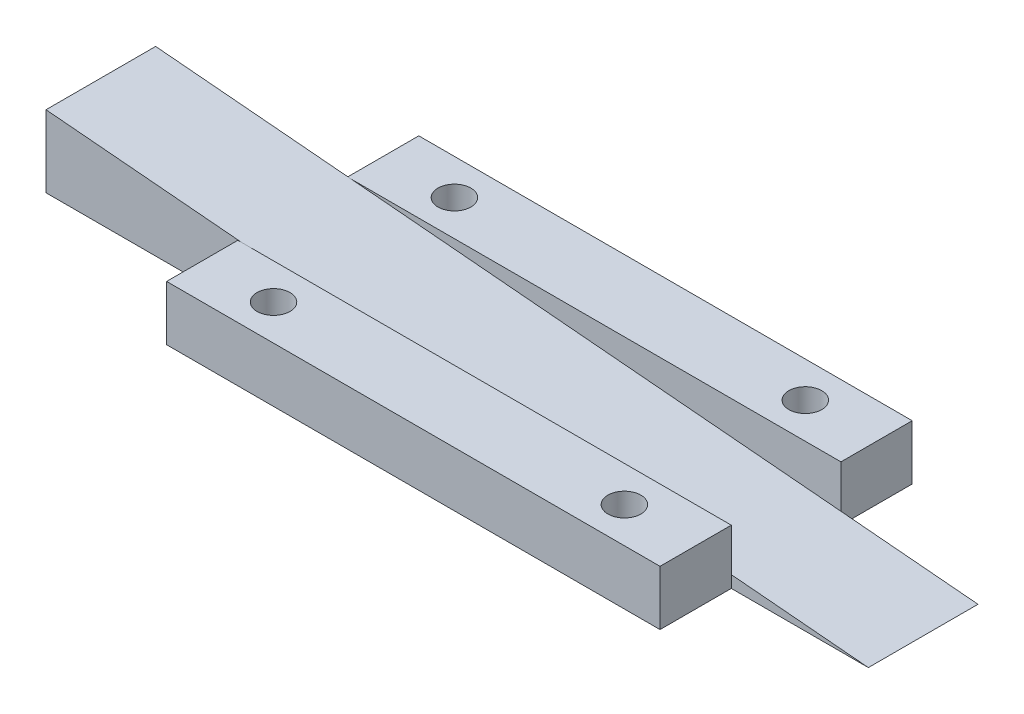
ISO-10303-21;
HEADER;
FILE_DESCRIPTION(('STEP AP214'),'2;1');
FILE_NAME('part.step','',(''),(''),'','','');
FILE_SCHEMA(('AUTOMOTIVE_DESIGN { 1 0 10303 214 1 1 1 1 }'));
ENDSEC;
DATA;
#1=APPLICATION_CONTEXT('core data for automotive mechanical design processes');
#2=APPLICATION_PROTOCOL_DEFINITION('international standard','automotive_design',2000,#1);
#3=PRODUCT_CONTEXT('',#1,'mechanical');
#4=PRODUCT('Part','Part','',(#3));
#5=PRODUCT_RELATED_PRODUCT_CATEGORY('part','',(#4));
#6=PRODUCT_DEFINITION_FORMATION('','',#4);
#7=PRODUCT_DEFINITION_CONTEXT('part definition',#1,'design');
#8=PRODUCT_DEFINITION('design','',#6,#7);
#9=PRODUCT_DEFINITION_SHAPE('','',#8);
#10=(LENGTH_UNIT() NAMED_UNIT(*) SI_UNIT(.MILLI.,.METRE.));
#11=(NAMED_UNIT(*) PLANE_ANGLE_UNIT() SI_UNIT($,.RADIAN.));
#12=(NAMED_UNIT(*) SI_UNIT($,.STERADIAN.) SOLID_ANGLE_UNIT());
#13=UNCERTAINTY_MEASURE_WITH_UNIT(LENGTH_MEASURE(1.E-05),#10,'distance_accuracy_value','');
#14=(GEOMETRIC_REPRESENTATION_CONTEXT(3) GLOBAL_UNCERTAINTY_ASSIGNED_CONTEXT((#13)) GLOBAL_UNIT_ASSIGNED_CONTEXT((#10,
#11,#12)) REPRESENTATION_CONTEXT('',''));
#15=CARTESIAN_POINT('',(0.,0.,0.));
#16=DIRECTION('',(0.,0.,1.));
#17=DIRECTION('',(1.,0.,0.));
#18=AXIS2_PLACEMENT_3D('',#15,#16,#17);
#19=CARTESIAN_POINT('',(0.,0.,-10.));
#20=DIRECTION('',(0.,0.,1.));
#21=DIRECTION('',(1.,0.,0.));
#22=AXIS2_PLACEMENT_3D('',#19,#20,#21);
#23=PLANE('',#22);
#24=DIRECTION('',(1.,0.,0.));
#25=VECTOR('',#24,1.);
#26=CARTESIAN_POINT('',(-49.0277574435194,0.,-10.));
#27=LINE('',#26,#25);
#28=CARTESIAN_POINT('',(75.9722425564806,0.,-10.));
#29=VERTEX_POINT('',#28);
#30=CARTESIAN_POINT('',(100.972242556481,0.,-10.));
#31=VERTEX_POINT('',#30);
#32=EDGE_CURVE('E254',#29,#31,#27,.T.);
#33=ORIENTED_EDGE('',*,*,#32,.F.);
#34=DIRECTION('',(0.,1.,0.));
#35=VECTOR('',#34,1.);
#36=CARTESIAN_POINT('',(75.9722425564806,0.,-10.));
#37=LINE('',#36,#35);
#38=CARTESIAN_POINT('',(75.9722425564806,2.18721658814793,-10.));
#39=VERTEX_POINT('',#38);
#40=EDGE_CURVE('E150',#29,#39,#37,.T.);
#41=ORIENTED_EDGE('',*,*,#40,.T.);
#42=DIRECTION('',(-0.996194698091746,0.0871557427476513,0.));
#43=VECTOR('',#42,1.);
#44=CARTESIAN_POINT('',(100.972242556481,0.,-10.));
#45=LINE('',#44,#43);
#46=EDGE_CURVE('E241',#31,#39,#45,.T.);
#47=ORIENTED_EDGE('',*,*,#46,.F.);
#48=EDGE_LOOP('',(#33,#41,#47));
#49=FACE_BOUND('',#48,.T.);
#50=ADVANCED_FACE('F43',(#49),#23,.F.);
#51=CARTESIAN_POINT('',(0.,0.,10.));
#52=DIRECTION('',(0.,0.,1.));
#53=DIRECTION('',(1.,0.,0.));
#54=AXIS2_PLACEMENT_3D('',#51,#52,#53);
#55=PLANE('',#54);
#56=DIRECTION('',(0.,-1.,0.));
#57=VECTOR('',#56,1.);
#58=CARTESIAN_POINT('',(-14.0277574435194,0.,10.));
#59=LINE('',#58,#57);
#60=CARTESIAN_POINT('',(-14.0277574435194,10.,10.));
#61=VERTEX_POINT('',#60);
#62=CARTESIAN_POINT('',(-14.0277574435194,0.,10.));
#63=VERTEX_POINT('',#62);
#64=EDGE_CURVE('E70',#61,#63,#59,.T.);
#65=ORIENTED_EDGE('',*,*,#64,.F.);
#66=DIRECTION('',(-1.,0.,0.));
#67=VECTOR('',#66,1.);
#68=CARTESIAN_POINT('',(-14.0277574435194,10.,10.));
#69=LINE('',#68,#67);
#70=CARTESIAN_POINT('',(-13.3282804711446,10.0000000000001,10.));
#71=VERTEX_POINT('',#70);
#72=EDGE_CURVE('E53',#71,#61,#69,.T.);
#73=ORIENTED_EDGE('',*,*,#72,.F.);
#74=DIRECTION('',(-0.996194698091746,0.0871557427476513,0.));
#75=VECTOR('',#74,1.);
#76=CARTESIAN_POINT('',(100.972242556481,0.,10.));
#77=LINE('',#76,#75);
#78=CARTESIAN_POINT('',(-49.0277574435194,13.1232995288876,10.));
#79=VERTEX_POINT('',#78);
#80=EDGE_CURVE('E245',#71,#79,#77,.T.);
#81=ORIENTED_EDGE('',*,*,#80,.T.);
#82=DIRECTION('',(0.,-1.,0.));
#83=VECTOR('',#82,1.);
#84=CARTESIAN_POINT('',(-49.0277574435194,13.1232995288876,10.));
#85=LINE('',#84,#83);
#86=CARTESIAN_POINT('',(-49.0277574435194,0.,10.));
#87=VERTEX_POINT('',#86);
#88=EDGE_CURVE('E236',#79,#87,#85,.T.);
#89=ORIENTED_EDGE('',*,*,#88,.T.);
#90=DIRECTION('',(1.,0.,0.));
#91=VECTOR('',#90,1.);
#92=CARTESIAN_POINT('',(-49.0277574435194,0.,10.));
#93=LINE('',#92,#91);
#94=EDGE_CURVE('E242',#87,#63,#93,.T.);
#95=ORIENTED_EDGE('',*,*,#94,.T.);
#96=EDGE_LOOP('',(#65,#73,#81,#89,#95));
#97=FACE_BOUND('',#96,.T.);
#98=ADVANCED_FACE('F300',(#97),#55,.T.);
#99=CARTESIAN_POINT('',(-49.0277574435194,13.1232995288876,10.));
#100=DIRECTION('',(1.,0.,0.));
#101=DIRECTION('',(0.,0.,-1.));
#102=AXIS2_PLACEMENT_3D('',#99,#100,#101);
#103=PLANE('',#102);
#104=DIRECTION('',(0.,-1.,0.));
#105=VECTOR('',#104,1.);
#106=CARTESIAN_POINT('',(-49.0277574435194,13.1232995288876,-10.));
#107=LINE('',#106,#105);
#108=CARTESIAN_POINT('',(-49.0277574435194,13.1232995288876,-10.));
#109=VERTEX_POINT('',#108);
#110=CARTESIAN_POINT('',(-49.0277574435194,0.,-10.));
#111=VERTEX_POINT('',#110);
#112=EDGE_CURVE('E235',#109,#111,#107,.T.);
#113=ORIENTED_EDGE('',*,*,#112,.T.);
#114=DIRECTION('',(0.,0.,-1.));
#115=VECTOR('',#114,1.);
#116=CARTESIAN_POINT('',(-49.0277574435194,0.,10.));
#117=LINE('',#116,#115);
#118=EDGE_CURVE('E47',#87,#111,#117,.T.);
#119=ORIENTED_EDGE('',*,*,#118,.F.);
#120=ORIENTED_EDGE('',*,*,#88,.F.);
#121=DIRECTION('',(0.,0.,-1.));
#122=VECTOR('',#121,1.);
#123=CARTESIAN_POINT('',(-49.0277574435194,13.1232995288876,10.));
#124=LINE('',#123,#122);
#125=EDGE_CURVE('E249',#79,#109,#124,.T.);
#126=ORIENTED_EDGE('',*,*,#125,.T.);
#127=EDGE_LOOP('',(#113,#119,#120,#126));
#128=FACE_BOUND('',#127,.T.);
#129=ADVANCED_FACE('F45',(#128),#103,.F.);
#130=CARTESIAN_POINT('',(-49.0277574435194,0.,10.));
#131=DIRECTION('',(0.,1.,0.));
#132=DIRECTION('',(0.,0.,1.));
#133=AXIS2_PLACEMENT_3D('',#130,#131,#132);
#134=PLANE('',#133);
#135=CARTESIAN_POINT('',(-1.02775744351938,0.,-16.5));
#136=DIRECTION('',(0.,1.,0.));
#137=DIRECTION('',(0.,0.,1.));
#138=AXIS2_PLACEMENT_3D('',#135,#136,#137);
#139=CIRCLE('',#138,3.00000000000001);
#140=CARTESIAN_POINT('',(-4.02775744351939,0.,-16.5));
#141=VERTEX_POINT('',#140);
#142=EDGE_CURVE('E350',#141,#141,#139,.F.);
#143=ORIENTED_EDGE('',*,*,#142,.F.);
#144=EDGE_LOOP('',(#143));
#145=FACE_BOUND('',#144,.T.);
#146=CARTESIAN_POINT('',(62.9722425564806,0.,-16.5));
#147=DIRECTION('',(0.,1.,0.));
#148=DIRECTION('',(0.,0.,1.));
#149=AXIS2_PLACEMENT_3D('',#146,#147,#148);
#150=CIRCLE('',#149,3.00000000000001);
#151=CARTESIAN_POINT('',(59.9722425564806,0.,-16.5));
#152=VERTEX_POINT('',#151);
#153=EDGE_CURVE('E354',#152,#152,#150,.F.);
#154=ORIENTED_EDGE('',*,*,#153,.F.);
#155=EDGE_LOOP('',(#154));
#156=FACE_BOUND('',#155,.T.);
#157=CARTESIAN_POINT('',(62.9722425564806,0.,16.5));
#158=DIRECTION('',(0.,1.,0.));
#159=DIRECTION('',(0.,0.,1.));
#160=AXIS2_PLACEMENT_3D('',#157,#158,#159);
#161=CIRCLE('',#160,3.00000000000001);
#162=CARTESIAN_POINT('',(59.9722425564806,0.,16.5));
#163=VERTEX_POINT('',#162);
#164=EDGE_CURVE('E176',#163,#163,#161,.F.);
#165=ORIENTED_EDGE('',*,*,#164,.F.);
#166=EDGE_LOOP('',(#165));
#167=FACE_BOUND('',#166,.T.);
#168=CARTESIAN_POINT('',(-1.02775744351938,0.,16.5));
#169=DIRECTION('',(0.,1.,0.));
#170=DIRECTION('',(0.,0.,1.));
#171=AXIS2_PLACEMENT_3D('',#168,#169,#170);
#172=CIRCLE('',#171,3.00000000000001);
#173=CARTESIAN_POINT('',(-4.02775744351939,0.,16.5));
#174=VERTEX_POINT('',#173);
#175=EDGE_CURVE('E360',#174,#174,#172,.F.);
#176=ORIENTED_EDGE('',*,*,#175,.F.);
#177=EDGE_LOOP('',(#176));
#178=FACE_BOUND('',#177,.T.);
#179=CARTESIAN_POINT('',(-14.0277574435194,0.,-10.));
#180=VERTEX_POINT('',#179);
#181=EDGE_CURVE('E255',#111,#180,#27,.T.);
#182=ORIENTED_EDGE('',*,*,#181,.T.);
#183=DIRECTION('',(0.,0.,1.));
#184=VECTOR('',#183,1.);
#185=CARTESIAN_POINT('',(-14.0277574435194,0.,-23.));
#186=LINE('',#185,#184);
#187=CARTESIAN_POINT('',(-14.0277574435194,0.,-23.));
#188=VERTEX_POINT('',#187);
#189=EDGE_CURVE('E62',#188,#180,#186,.T.);
#190=ORIENTED_EDGE('',*,*,#189,.F.);
#191=DIRECTION('',(1.,0.,0.));
#192=VECTOR('',#191,1.);
#193=CARTESIAN_POINT('',(-14.0277574435194,0.,-23.));
#194=LINE('',#193,#192);
#195=CARTESIAN_POINT('',(75.9722425564806,0.,-23.));
#196=VERTEX_POINT('',#195);
#197=EDGE_CURVE('E163',#188,#196,#194,.T.);
#198=ORIENTED_EDGE('',*,*,#197,.T.);
#199=DIRECTION('',(0.,0.,1.));
#200=VECTOR('',#199,1.);
#201=CARTESIAN_POINT('',(75.9722425564806,0.,-23.));
#202=LINE('',#201,#200);
#203=EDGE_CURVE('E143',#196,#29,#202,.T.);
#204=ORIENTED_EDGE('',*,*,#203,.T.);
#205=ORIENTED_EDGE('',*,*,#32,.T.);
#206=DIRECTION('',(0.,0.,-1.));
#207=VECTOR('',#206,1.);
#208=CARTESIAN_POINT('',(100.972242556481,0.,10.));
#209=LINE('',#208,#207);
#210=CARTESIAN_POINT('',(100.972242556481,0.,10.));
#211=VERTEX_POINT('',#210);
#212=EDGE_CURVE('E265',#211,#31,#209,.T.);
#213=ORIENTED_EDGE('',*,*,#212,.F.);
#214=CARTESIAN_POINT('',(75.9722425564806,0.,10.));
#215=VERTEX_POINT('',#214);
#216=EDGE_CURVE('E240',#215,#211,#93,.T.);
#217=ORIENTED_EDGE('',*,*,#216,.F.);
#218=DIRECTION('',(0.,0.,-1.));
#219=VECTOR('',#218,1.);
#220=CARTESIAN_POINT('',(75.9722425564806,0.,23.));
#221=LINE('',#220,#219);
#222=CARTESIAN_POINT('',(75.9722425564806,0.,23.));
#223=VERTEX_POINT('',#222);
#224=EDGE_CURVE('E231',#223,#215,#221,.T.);
#225=ORIENTED_EDGE('',*,*,#224,.F.);
#226=DIRECTION('',(1.,0.,0.));
#227=VECTOR('',#226,1.);
#228=CARTESIAN_POINT('',(-14.0277574435194,0.,23.));
#229=LINE('',#228,#227);
#230=CARTESIAN_POINT('',(-14.0277574435194,0.,23.));
#231=VERTEX_POINT('',#230);
#232=EDGE_CURVE('E196',#231,#223,#229,.T.);
#233=ORIENTED_EDGE('',*,*,#232,.F.);
#234=DIRECTION('',(0.,0.,-1.));
#235=VECTOR('',#234,1.);
#236=CARTESIAN_POINT('',(-14.0277574435194,0.,23.));
#237=LINE('',#236,#235);
#238=EDGE_CURVE('E209',#231,#63,#237,.T.);
#239=ORIENTED_EDGE('',*,*,#238,.T.);
#240=ORIENTED_EDGE('',*,*,#94,.F.);
#241=ORIENTED_EDGE('',*,*,#118,.T.);
#242=EDGE_LOOP('',(#182,#190,#198,#204,#205,#213,#217,#225,#233,#239,#240,#241));
#243=FACE_BOUND('',#242,.T.);
#244=ADVANCED_FACE('F169',(#145,#156,#167,#178,#243),#134,.F.);
#245=CARTESIAN_POINT('',(100.972242556481,0.,10.));
#246=DIRECTION('',(-0.0871557427476513,-0.996194698091746,0.));
#247=DIRECTION('',(0.996194698091746,-0.0871557427476513,0.));
#248=AXIS2_PLACEMENT_3D('',#245,#246,#247);
#249=PLANE('',#248);
#250=ORIENTED_EDGE('',*,*,#46,.T.);
#251=CARTESIAN_POINT('',(-13.3282804711446,10.,-10.));
#252=VERTEX_POINT('',#251);
#253=EDGE_CURVE('E262',#39,#252,#45,.T.);
#254=ORIENTED_EDGE('',*,*,#253,.T.);
#255=EDGE_CURVE('E258',#252,#109,#45,.T.);
#256=ORIENTED_EDGE('',*,*,#255,.T.);
#257=ORIENTED_EDGE('',*,*,#125,.F.);
#258=ORIENTED_EDGE('',*,*,#80,.F.);
#259=CARTESIAN_POINT('',(75.9722425564806,2.18721658814793,10.));
#260=VERTEX_POINT('',#259);
#261=EDGE_CURVE('E250',#260,#71,#77,.T.);
#262=ORIENTED_EDGE('',*,*,#261,.F.);
#263=EDGE_CURVE('E246',#211,#260,#77,.T.);
#264=ORIENTED_EDGE('',*,*,#263,.F.);
#265=ORIENTED_EDGE('',*,*,#212,.T.);
#266=EDGE_LOOP('',(#250,#254,#256,#257,#258,#262,#264,#265));
#267=FACE_BOUND('',#266,.T.);
#268=ADVANCED_FACE('F302',(#267),#249,.F.);
#269=DIRECTION('',(0.,1.,0.));
#270=VECTOR('',#269,1.);
#271=CARTESIAN_POINT('',(75.9722425564806,0.,10.));
#272=LINE('',#271,#270);
#273=EDGE_CURVE('E210',#215,#260,#272,.T.);
#274=ORIENTED_EDGE('',*,*,#273,.F.);
#275=ORIENTED_EDGE('',*,*,#216,.T.);
#276=ORIENTED_EDGE('',*,*,#263,.T.);
#277=EDGE_LOOP('',(#274,#275,#276));
#278=FACE_BOUND('',#277,.T.);
#279=ADVANCED_FACE('F323',(#278),#55,.T.);
#280=ORIENTED_EDGE('',*,*,#255,.F.);
#281=DIRECTION('',(-1.,0.,0.));
#282=VECTOR('',#281,1.);
#283=CARTESIAN_POINT('',(-14.0277574435194,10.,-10.));
#284=LINE('',#283,#282);
#285=CARTESIAN_POINT('',(-14.0277574435194,10.,-10.));
#286=VERTEX_POINT('',#285);
#287=EDGE_CURVE('E11',#252,#286,#284,.T.);
#288=ORIENTED_EDGE('',*,*,#287,.T.);
#289=DIRECTION('',(0.,-1.,0.));
#290=VECTOR('',#289,1.);
#291=CARTESIAN_POINT('',(-14.0277574435194,0.,-10.));
#292=LINE('',#291,#290);
#293=EDGE_CURVE('E171',#286,#180,#292,.T.);
#294=ORIENTED_EDGE('',*,*,#293,.T.);
#295=ORIENTED_EDGE('',*,*,#181,.F.);
#296=ORIENTED_EDGE('',*,*,#112,.F.);
#297=EDGE_LOOP('',(#280,#288,#294,#295,#296));
#298=FACE_BOUND('',#297,.T.);
#299=ADVANCED_FACE('F308',(#298),#23,.F.);
#300=CARTESIAN_POINT('',(0.,0.,10.));
#301=DIRECTION('',(0.,0.,1.));
#302=DIRECTION('',(1.,0.,0.));
#303=AXIS2_PLACEMENT_3D('',#300,#301,#302);
#304=PLANE('',#303);
#305=CARTESIAN_POINT('',(75.9722425564806,10.,10.));
#306=VERTEX_POINT('',#305);
#307=EDGE_CURVE('E190',#260,#306,#272,.T.);
#308=ORIENTED_EDGE('',*,*,#307,.F.);
#309=ORIENTED_EDGE('',*,*,#261,.T.);
#310=EDGE_CURVE('E214',#306,#71,#69,.T.);
#311=ORIENTED_EDGE('',*,*,#310,.F.);
#312=EDGE_LOOP('',(#308,#309,#311));
#313=FACE_BOUND('',#312,.T.);
#314=ADVANCED_FACE('F295',(#313),#304,.F.);
#315=CARTESIAN_POINT('',(75.9722425564806,0.,23.));
#316=DIRECTION('',(-1.,0.,0.));
#317=DIRECTION('',(0.,0.,1.));
#318=AXIS2_PLACEMENT_3D('',#315,#316,#317);
#319=PLANE('',#318);
#320=ORIENTED_EDGE('',*,*,#273,.T.);
#321=ORIENTED_EDGE('',*,*,#307,.T.);
#322=DIRECTION('',(0.,0.,-1.));
#323=VECTOR('',#322,1.);
#324=CARTESIAN_POINT('',(75.9722425564806,10.,23.));
#325=LINE('',#324,#323);
#326=CARTESIAN_POINT('',(75.9722425564806,10.,23.));
#327=VERTEX_POINT('',#326);
#328=EDGE_CURVE('E227',#327,#306,#325,.T.);
#329=ORIENTED_EDGE('',*,*,#328,.F.);
#330=DIRECTION('',(0.,1.,0.));
#331=VECTOR('',#330,1.);
#332=CARTESIAN_POINT('',(75.9722425564806,0.,23.));
#333=LINE('',#332,#331);
#334=EDGE_CURVE('E200',#223,#327,#333,.T.);
#335=ORIENTED_EDGE('',*,*,#334,.F.);
#336=ORIENTED_EDGE('',*,*,#224,.T.);
#337=EDGE_LOOP('',(#320,#321,#329,#335,#336));
#338=FACE_BOUND('',#337,.T.);
#339=ADVANCED_FACE('F320',(#338),#319,.F.);
#340=CARTESIAN_POINT('',(-14.0277574435194,10.,23.));
#341=DIRECTION('',(0.,-1.,0.));
#342=DIRECTION('',(1.,0.,0.));
#343=AXIS2_PLACEMENT_3D('',#340,#341,#342);
#344=PLANE('',#343);
#345=CARTESIAN_POINT('',(62.9722425564806,10.,16.5));
#346=DIRECTION('',(0.,-1.,0.));
#347=DIRECTION('',(1.,0.,0.));
#348=AXIS2_PLACEMENT_3D('',#345,#346,#347);
#349=CIRCLE('',#348,3.00000000000001);
#350=CARTESIAN_POINT('',(59.9722425564806,10.,16.5));
#351=VERTEX_POINT('',#350);
#352=EDGE_CURVE('E373',#351,#351,#349,.T.);
#353=ORIENTED_EDGE('',*,*,#352,.T.);
#354=EDGE_LOOP('',(#353));
#355=FACE_BOUND('',#354,.T.);
#356=CARTESIAN_POINT('',(-1.02775744351938,10.,16.5));
#357=DIRECTION('',(0.,-1.,0.));
#358=DIRECTION('',(1.,0.,0.));
#359=AXIS2_PLACEMENT_3D('',#356,#357,#358);
#360=CIRCLE('',#359,3.00000000000001);
#361=CARTESIAN_POINT('',(-4.02775744351939,10.,16.5));
#362=VERTEX_POINT('',#361);
#363=EDGE_CURVE('E369',#362,#362,#360,.T.);
#364=ORIENTED_EDGE('',*,*,#363,.T.);
#365=EDGE_LOOP('',(#364));
#366=FACE_BOUND('',#365,.T.);
#367=ORIENTED_EDGE('',*,*,#310,.T.);
#368=ORIENTED_EDGE('',*,*,#72,.T.);
#369=DIRECTION('',(0.,0.,-1.));
#370=VECTOR('',#369,1.);
#371=CARTESIAN_POINT('',(-14.0277574435194,10.,23.));
#372=LINE('',#371,#370);
#373=CARTESIAN_POINT('',(-14.0277574435194,10.,23.));
#374=VERTEX_POINT('',#373);
#375=EDGE_CURVE('E223',#374,#61,#372,.T.);
#376=ORIENTED_EDGE('',*,*,#375,.F.);
#377=DIRECTION('',(-1.,0.,0.));
#378=VECTOR('',#377,1.);
#379=CARTESIAN_POINT('',(-14.0277574435194,10.,23.));
#380=LINE('',#379,#378);
#381=EDGE_CURVE('E203',#327,#374,#380,.T.);
#382=ORIENTED_EDGE('',*,*,#381,.F.);
#383=ORIENTED_EDGE('',*,*,#328,.T.);
#384=EDGE_LOOP('',(#367,#368,#376,#382,#383));
#385=FACE_BOUND('',#384,.T.);
#386=ADVANCED_FACE('F278',(#355,#366,#385),#344,.F.);
#387=CARTESIAN_POINT('',(-14.0277574435194,0.,23.));
#388=DIRECTION('',(1.,0.,0.));
#389=DIRECTION('',(0.,1.,0.));
#390=AXIS2_PLACEMENT_3D('',#387,#388,#389);
#391=PLANE('',#390);
#392=ORIENTED_EDGE('',*,*,#64,.T.);
#393=ORIENTED_EDGE('',*,*,#238,.F.);
#394=DIRECTION('',(0.,-1.,0.));
#395=VECTOR('',#394,1.);
#396=CARTESIAN_POINT('',(-14.0277574435194,0.,23.));
#397=LINE('',#396,#395);
#398=EDGE_CURVE('E206',#374,#231,#397,.T.);
#399=ORIENTED_EDGE('',*,*,#398,.F.);
#400=ORIENTED_EDGE('',*,*,#375,.T.);
#401=EDGE_LOOP('',(#392,#393,#399,#400));
#402=FACE_BOUND('',#401,.T.);
#403=ADVANCED_FACE('F284',(#402),#391,.F.);
#404=CARTESIAN_POINT('',(0.,0.,23.));
#405=DIRECTION('',(0.,0.,1.));
#406=DIRECTION('',(1.,0.,0.));
#407=AXIS2_PLACEMENT_3D('',#404,#405,#406);
#408=PLANE('',#407);
#409=ORIENTED_EDGE('',*,*,#232,.T.);
#410=ORIENTED_EDGE('',*,*,#334,.T.);
#411=ORIENTED_EDGE('',*,*,#381,.T.);
#412=ORIENTED_EDGE('',*,*,#398,.T.);
#413=EDGE_LOOP('',(#409,#410,#411,#412));
#414=FACE_BOUND('',#413,.T.);
#415=ADVANCED_FACE('F288',(#414),#408,.T.);
#416=CARTESIAN_POINT('',(0.,0.,-10.));
#417=DIRECTION('',(0.,0.,1.));
#418=DIRECTION('',(1.,0.,0.));
#419=AXIS2_PLACEMENT_3D('',#416,#417,#418);
#420=PLANE('',#419);
#421=ORIENTED_EDGE('',*,*,#253,.F.);
#422=CARTESIAN_POINT('',(75.9722425564806,10.,-10.));
#423=VERTEX_POINT('',#422);
#424=EDGE_CURVE('E184',#39,#423,#37,.T.);
#425=ORIENTED_EDGE('',*,*,#424,.T.);
#426=EDGE_CURVE('E55',#423,#252,#284,.T.);
#427=ORIENTED_EDGE('',*,*,#426,.T.);
#428=EDGE_LOOP('',(#421,#425,#427));
#429=FACE_BOUND('',#428,.T.);
#430=ADVANCED_FACE('F409',(#429),#420,.T.);
#431=CARTESIAN_POINT('',(-14.0277574435194,0.,-23.));
#432=DIRECTION('',(-1.,0.,0.));
#433=DIRECTION('',(0.,-1.,0.));
#434=AXIS2_PLACEMENT_3D('',#431,#432,#433);
#435=PLANE('',#434);
#436=ORIENTED_EDGE('',*,*,#293,.F.);
#437=DIRECTION('',(0.,0.,1.));
#438=VECTOR('',#437,1.);
#439=CARTESIAN_POINT('',(-14.0277574435194,10.,-23.));
#440=LINE('',#439,#438);
#441=CARTESIAN_POINT('',(-14.0277574435194,10.,-23.));
#442=VERTEX_POINT('',#441);
#443=EDGE_CURVE('E191',#442,#286,#440,.T.);
#444=ORIENTED_EDGE('',*,*,#443,.F.);
#445=DIRECTION('',(0.,-1.,0.));
#446=VECTOR('',#445,1.);
#447=CARTESIAN_POINT('',(-14.0277574435194,0.,-23.));
#448=LINE('',#447,#446);
#449=EDGE_CURVE('E156',#442,#188,#448,.T.);
#450=ORIENTED_EDGE('',*,*,#449,.T.);
#451=ORIENTED_EDGE('',*,*,#189,.T.);
#452=EDGE_LOOP('',(#436,#444,#450,#451));
#453=FACE_BOUND('',#452,.T.);
#454=ADVANCED_FACE('F309',(#453),#435,.T.);
#455=CARTESIAN_POINT('',(-14.0277574435194,10.,-23.));
#456=DIRECTION('',(0.,1.,0.));
#457=DIRECTION('',(-1.,0.,0.));
#458=AXIS2_PLACEMENT_3D('',#455,#456,#457);
#459=PLANE('',#458);
#460=CARTESIAN_POINT('',(-1.02775744351938,10.,-16.5));
#461=DIRECTION('',(0.,-1.,0.));
#462=DIRECTION('',(1.,0.,0.));
#463=AXIS2_PLACEMENT_3D('',#460,#461,#462);
#464=CIRCLE('',#463,3.00000000000001);
#465=CARTESIAN_POINT('',(-4.02775744351939,10.,-16.5));
#466=VERTEX_POINT('',#465);
#467=EDGE_CURVE('E374',#466,#466,#464,.T.);
#468=ORIENTED_EDGE('',*,*,#467,.T.);
#469=EDGE_LOOP('',(#468));
#470=FACE_BOUND('',#469,.T.);
#471=CARTESIAN_POINT('',(62.9722425564806,10.,-16.5));
#472=DIRECTION('',(0.,-1.,0.));
#473=DIRECTION('',(1.,0.,0.));
#474=AXIS2_PLACEMENT_3D('',#471,#472,#473);
#475=CIRCLE('',#474,3.00000000000001);
#476=CARTESIAN_POINT('',(59.9722425564806,10.,-16.5));
#477=VERTEX_POINT('',#476);
#478=EDGE_CURVE('E378',#477,#477,#475,.T.);
#479=ORIENTED_EDGE('',*,*,#478,.T.);
#480=EDGE_LOOP('',(#479));
#481=FACE_BOUND('',#480,.T.);
#482=ORIENTED_EDGE('',*,*,#426,.F.);
#483=DIRECTION('',(0.,0.,1.));
#484=VECTOR('',#483,1.);
#485=CARTESIAN_POINT('',(75.9722425564806,10.,-23.));
#486=LINE('',#485,#484);
#487=CARTESIAN_POINT('',(75.9722425564806,10.,-23.));
#488=VERTEX_POINT('',#487);
#489=EDGE_CURVE('E155',#488,#423,#486,.T.);
#490=ORIENTED_EDGE('',*,*,#489,.F.);
#491=DIRECTION('',(-1.,0.,0.));
#492=VECTOR('',#491,1.);
#493=CARTESIAN_POINT('',(-14.0277574435194,10.,-23.));
#494=LINE('',#493,#492);
#495=EDGE_CURVE('E165',#488,#442,#494,.T.);
#496=ORIENTED_EDGE('',*,*,#495,.T.);
#497=ORIENTED_EDGE('',*,*,#443,.T.);
#498=ORIENTED_EDGE('',*,*,#287,.F.);
#499=EDGE_LOOP('',(#482,#490,#496,#497,#498));
#500=FACE_BOUND('',#499,.T.);
#501=ADVANCED_FACE('F312',(#470,#481,#500),#459,.T.);
#502=CARTESIAN_POINT('',(75.9722425564806,0.,-23.));
#503=DIRECTION('',(1.,0.,0.));
#504=DIRECTION('',(0.,0.,-1.));
#505=AXIS2_PLACEMENT_3D('',#502,#503,#504);
#506=PLANE('',#505);
#507=ORIENTED_EDGE('',*,*,#40,.F.);
#508=ORIENTED_EDGE('',*,*,#203,.F.);
#509=DIRECTION('',(0.,1.,0.));
#510=VECTOR('',#509,1.);
#511=CARTESIAN_POINT('',(75.9722425564806,0.,-23.));
#512=LINE('',#511,#510);
#513=EDGE_CURVE('E147',#196,#488,#512,.T.);
#514=ORIENTED_EDGE('',*,*,#513,.T.);
#515=ORIENTED_EDGE('',*,*,#489,.T.);
#516=ORIENTED_EDGE('',*,*,#424,.F.);
#517=EDGE_LOOP('',(#507,#508,#514,#515,#516));
#518=FACE_BOUND('',#517,.T.);
#519=ADVANCED_FACE('F145',(#518),#506,.T.);
#520=CARTESIAN_POINT('',(0.,0.,-23.));
#521=DIRECTION('',(0.,0.,1.));
#522=DIRECTION('',(1.,0.,0.));
#523=AXIS2_PLACEMENT_3D('',#520,#521,#522);
#524=PLANE('',#523);
#525=ORIENTED_EDGE('',*,*,#197,.F.);
#526=ORIENTED_EDGE('',*,*,#449,.F.);
#527=ORIENTED_EDGE('',*,*,#495,.F.);
#528=ORIENTED_EDGE('',*,*,#513,.F.);
#529=EDGE_LOOP('',(#525,#526,#527,#528));
#530=FACE_BOUND('',#529,.T.);
#531=ADVANCED_FACE('F161',(#530),#524,.F.);
#532=CARTESIAN_POINT('',(62.9722425564806,-3.,-16.5));
#533=DIRECTION('',(0.,1.,0.));
#534=DIRECTION('',(-1.,0.,0.));
#535=AXIS2_PLACEMENT_3D('',#532,#533,#534);
#536=CYLINDRICAL_SURFACE('',#535,3.00000000000001);
#537=CARTESIAN_POINT('',(59.9722425564806,10.,-16.5));
#538=CARTESIAN_POINT('',(59.9722425564806,9.89583333333334,-16.5));
#539=CARTESIAN_POINT('',(59.9722425564806,9.79166666666667,-16.5));
#540=CARTESIAN_POINT('',(59.9722425564806,9.58333333333334,-16.5));
#541=CARTESIAN_POINT('',(59.9722425564806,9.47916666666667,-16.5));
#542=CARTESIAN_POINT('',(59.9722425564806,9.27083333333334,-16.5));
#543=CARTESIAN_POINT('',(59.9722425564806,9.16666666666667,-16.5));
#544=CARTESIAN_POINT('',(59.9722425564806,8.95833333333334,-16.5));
#545=CARTESIAN_POINT('',(59.9722425564806,8.85416666666667,-16.5));
#546=CARTESIAN_POINT('',(59.9722425564806,8.64583333333334,-16.5));
#547=CARTESIAN_POINT('',(59.9722425564806,8.54166666666667,-16.5));
#548=CARTESIAN_POINT('',(59.9722425564806,8.33333333333334,-16.5));
#549=CARTESIAN_POINT('',(59.9722425564806,8.22916666666667,-16.5));
#550=CARTESIAN_POINT('',(59.9722425564806,8.02083333333333,-16.5));
#551=CARTESIAN_POINT('',(59.9722425564806,7.91666666666667,-16.5));
#552=CARTESIAN_POINT('',(59.9722425564806,7.70833333333334,-16.5));
#553=CARTESIAN_POINT('',(59.9722425564806,7.60416666666667,-16.5));
#554=CARTESIAN_POINT('',(59.9722425564806,7.39583333333333,-16.5));
#555=CARTESIAN_POINT('',(59.9722425564806,7.29166666666667,-16.5));
#556=CARTESIAN_POINT('',(59.9722425564806,7.08333333333333,-16.5));
#557=CARTESIAN_POINT('',(59.9722425564806,6.97916666666667,-16.5));
#558=CARTESIAN_POINT('',(59.9722425564806,6.77083333333333,-16.5));
#559=CARTESIAN_POINT('',(59.9722425564806,6.66666666666667,-16.5));
#560=CARTESIAN_POINT('',(59.9722425564806,6.45833333333334,-16.5));
#561=CARTESIAN_POINT('',(59.9722425564806,6.35416666666667,-16.5));
#562=CARTESIAN_POINT('',(59.9722425564806,6.14583333333334,-16.5));
#563=CARTESIAN_POINT('',(59.9722425564806,6.04166666666667,-16.5));
#564=CARTESIAN_POINT('',(59.9722425564806,5.83333333333334,-16.5));
#565=CARTESIAN_POINT('',(59.9722425564806,5.72916666666667,-16.5));
#566=CARTESIAN_POINT('',(59.9722425564806,5.52083333333333,-16.5));
#567=CARTESIAN_POINT('',(59.9722425564806,5.41666666666667,-16.5));
#568=CARTESIAN_POINT('',(59.9722425564806,5.20833333333333,-16.5));
#569=CARTESIAN_POINT('',(59.9722425564806,5.10416666666667,-16.5));
#570=CARTESIAN_POINT('',(59.9722425564806,4.89583333333333,-16.5));
#571=CARTESIAN_POINT('',(59.9722425564806,4.79166666666667,-16.5));
#572=CARTESIAN_POINT('',(59.9722425564806,4.58333333333333,-16.5));
#573=CARTESIAN_POINT('',(59.9722425564806,4.47916666666667,-16.5));
#574=CARTESIAN_POINT('',(59.9722425564806,4.27083333333333,-16.5));
#575=CARTESIAN_POINT('',(59.9722425564806,4.16666666666667,-16.5));
#576=CARTESIAN_POINT('',(59.9722425564806,3.95833333333333,-16.5));
#577=CARTESIAN_POINT('',(59.9722425564806,3.85416666666667,-16.5));
#578=CARTESIAN_POINT('',(59.9722425564806,3.64583333333333,-16.5));
#579=CARTESIAN_POINT('',(59.9722425564806,3.54166666666667,-16.5));
#580=CARTESIAN_POINT('',(59.9722425564806,3.33333333333333,-16.5));
#581=CARTESIAN_POINT('',(59.9722425564806,3.22916666666667,-16.5));
#582=CARTESIAN_POINT('',(59.9722425564806,3.02083333333333,-16.5));
#583=CARTESIAN_POINT('',(59.9722425564806,2.91666666666667,-16.5));
#584=CARTESIAN_POINT('',(59.9722425564806,2.70833333333333,-16.5));
#585=CARTESIAN_POINT('',(59.9722425564806,2.60416666666667,-16.5));
#586=CARTESIAN_POINT('',(59.9722425564806,2.39583333333333,-16.5));
#587=CARTESIAN_POINT('',(59.9722425564806,2.29166666666667,-16.5));
#588=CARTESIAN_POINT('',(59.9722425564806,2.08333333333333,-16.5));
#589=CARTESIAN_POINT('',(59.9722425564806,1.97916666666667,-16.5));
#590=CARTESIAN_POINT('',(59.9722425564806,1.77083333333333,-16.5));
#591=CARTESIAN_POINT('',(59.9722425564806,1.66666666666667,-16.5));
#592=CARTESIAN_POINT('',(59.9722425564806,1.45833333333333,-16.5));
#593=CARTESIAN_POINT('',(59.9722425564806,1.35416666666667,-16.5));
#594=CARTESIAN_POINT('',(59.9722425564806,1.14583333333333,-16.5));
#595=CARTESIAN_POINT('',(59.9722425564806,1.04166666666667,-16.5));
#596=CARTESIAN_POINT('',(59.9722425564806,0.833333333333333,-16.5));
#597=CARTESIAN_POINT('',(59.9722425564806,0.729166666666667,-16.5));
#598=CARTESIAN_POINT('',(59.9722425564806,0.520833333333333,-16.5));
#599=CARTESIAN_POINT('',(59.9722425564806,0.416666666666667,-16.5));
#600=CARTESIAN_POINT('',(59.9722425564806,0.208333333333333,-16.5));
#601=CARTESIAN_POINT('',(59.9722425564806,0.104166666666666,-16.5));
#602=CARTESIAN_POINT('',(59.9722425564806,0.,-16.5));
#603=B_SPLINE_CURVE_WITH_KNOTS('',3,(#537,#538,#539,#540,#541,#542,#543,#544,#545,#546,#547,
#548,#549,#550,#551,#552,#553,#554,#555,#556,#557,#558,#559,#560,#561,#562,#563,#564,#565,#566,
#567,#568,#569,#570,#571,#572,#573,#574,#575,#576,#577,#578,#579,#580,#581,#582,#583,#584,#585,
#586,#587,#588,#589,#590,#591,#592,#593,#594,#595,#596,#597,#598,#599,#600,#601,#602),
.UNSPECIFIED.,.F.,.F.,(4,2,2,2,2,2,2,2,2,2,2,2,2,2,2,2,2,2,2,2,2,2,2,2,2,2,2,2,2,2,2,2,4),(0.,
0.3125,0.625000000000001,0.937500000000001,1.25,1.5625,1.875,2.1875,2.5,2.8125,3.125,3.4375,
3.75,4.0625,4.375,4.6875,5.,5.3125,5.625,5.9375,6.25,6.5625,6.875,7.1875,7.5,7.8125,8.125,
8.4375,8.75,9.06250000000001,9.37500000000001,9.68750000000001,10.),.UNSPECIFIED.);
#604=EDGE_CURVE('BSEAM400',#477,#152,#603,.T.);
#605=ORIENTED_EDGE('',*,*,#478,.F.);
#606=ORIENTED_EDGE('',*,*,#153,.T.);
#607=ORIENTED_EDGE('',*,*,#604,.T.);
#608=ORIENTED_EDGE('',*,*,#604,.F.);
#609=EDGE_LOOP('',(#605,#607,#606,#608));
#610=FACE_BOUND('',#609,.T.);
#611=ADVANCED_FACE('F400',(#610),#536,.F.);
#612=CARTESIAN_POINT('',(-1.02775744351938,-3.,-16.5));
#613=DIRECTION('',(0.,1.,0.));
#614=DIRECTION('',(-1.,0.,0.));
#615=AXIS2_PLACEMENT_3D('',#612,#613,#614);
#616=CYLINDRICAL_SURFACE('',#615,3.00000000000001);
#617=CARTESIAN_POINT('',(-4.02775744351939,10.,-16.5));
#618=CARTESIAN_POINT('',(-4.02775744351939,9.89583333333333,-16.5));
#619=CARTESIAN_POINT('',(-4.02775744351939,9.79166666666667,-16.5));
#620=CARTESIAN_POINT('',(-4.02775744351939,9.58333333333333,-16.5));
#621=CARTESIAN_POINT('',(-4.02775744351939,9.47916666666667,-16.5));
#622=CARTESIAN_POINT('',(-4.02775744351939,9.27083333333333,-16.5));
#623=CARTESIAN_POINT('',(-4.02775744351939,9.16666666666667,-16.5));
#624=CARTESIAN_POINT('',(-4.02775744351939,8.95833333333333,-16.5));
#625=CARTESIAN_POINT('',(-4.02775744351939,8.85416666666667,-16.5));
#626=CARTESIAN_POINT('',(-4.02775744351939,8.64583333333333,-16.5));
#627=CARTESIAN_POINT('',(-4.02775744351939,8.54166666666667,-16.5));
#628=CARTESIAN_POINT('',(-4.02775744351939,8.33333333333333,-16.5));
#629=CARTESIAN_POINT('',(-4.02775744351939,8.22916666666667,-16.5));
#630=CARTESIAN_POINT('',(-4.02775744351939,8.02083333333333,-16.5));
#631=CARTESIAN_POINT('',(-4.02775744351939,7.91666666666667,-16.5));
#632=CARTESIAN_POINT('',(-4.02775744351939,7.70833333333333,-16.5));
#633=CARTESIAN_POINT('',(-4.02775744351939,7.60416666666667,-16.5));
#634=CARTESIAN_POINT('',(-4.02775744351939,7.39583333333333,-16.5));
#635=CARTESIAN_POINT('',(-4.02775744351939,7.29166666666667,-16.5));
#636=CARTESIAN_POINT('',(-4.02775744351939,7.08333333333333,-16.5));
#637=CARTESIAN_POINT('',(-4.02775744351939,6.97916666666667,-16.5));
#638=CARTESIAN_POINT('',(-4.02775744351939,6.77083333333333,-16.5));
#639=CARTESIAN_POINT('',(-4.02775744351939,6.66666666666667,-16.5));
#640=CARTESIAN_POINT('',(-4.02775744351939,6.45833333333333,-16.5));
#641=CARTESIAN_POINT('',(-4.02775744351939,6.35416666666667,-16.5));
#642=CARTESIAN_POINT('',(-4.02775744351939,6.14583333333333,-16.5));
#643=CARTESIAN_POINT('',(-4.02775744351939,6.04166666666667,-16.5));
#644=CARTESIAN_POINT('',(-4.02775744351939,5.83333333333333,-16.5));
#645=CARTESIAN_POINT('',(-4.02775744351939,5.72916666666667,-16.5));
#646=CARTESIAN_POINT('',(-4.02775744351939,5.52083333333333,-16.5));
#647=CARTESIAN_POINT('',(-4.02775744351939,5.41666666666667,-16.5));
#648=CARTESIAN_POINT('',(-4.02775744351939,5.20833333333333,-16.5));
#649=CARTESIAN_POINT('',(-4.02775744351939,5.10416666666667,-16.5));
#650=CARTESIAN_POINT('',(-4.02775744351939,4.89583333333333,-16.5));
#651=CARTESIAN_POINT('',(-4.02775744351939,4.79166666666667,-16.5));
#652=CARTESIAN_POINT('',(-4.02775744351939,4.58333333333333,-16.5));
#653=CARTESIAN_POINT('',(-4.02775744351939,4.47916666666667,-16.5));
#654=CARTESIAN_POINT('',(-4.02775744351939,4.27083333333333,-16.5));
#655=CARTESIAN_POINT('',(-4.02775744351939,4.16666666666667,-16.5));
#656=CARTESIAN_POINT('',(-4.02775744351939,3.95833333333333,-16.5));
#657=CARTESIAN_POINT('',(-4.02775744351939,3.85416666666667,-16.5));
#658=CARTESIAN_POINT('',(-4.02775744351939,3.64583333333333,-16.5));
#659=CARTESIAN_POINT('',(-4.02775744351939,3.54166666666667,-16.5));
#660=CARTESIAN_POINT('',(-4.02775744351939,3.33333333333333,-16.5));
#661=CARTESIAN_POINT('',(-4.02775744351939,3.22916666666667,-16.5));
#662=CARTESIAN_POINT('',(-4.02775744351939,3.02083333333333,-16.5));
#663=CARTESIAN_POINT('',(-4.02775744351939,2.91666666666667,-16.5));
#664=CARTESIAN_POINT('',(-4.02775744351939,2.70833333333333,-16.5));
#665=CARTESIAN_POINT('',(-4.02775744351939,2.60416666666667,-16.5));
#666=CARTESIAN_POINT('',(-4.02775744351939,2.39583333333333,-16.5));
#667=CARTESIAN_POINT('',(-4.02775744351939,2.29166666666667,-16.5));
#668=CARTESIAN_POINT('',(-4.02775744351939,2.08333333333333,-16.5));
#669=CARTESIAN_POINT('',(-4.02775744351939,1.97916666666667,-16.5));
#670=CARTESIAN_POINT('',(-4.02775744351939,1.77083333333333,-16.5));
#671=CARTESIAN_POINT('',(-4.02775744351939,1.66666666666667,-16.5));
#672=CARTESIAN_POINT('',(-4.02775744351939,1.45833333333333,-16.5));
#673=CARTESIAN_POINT('',(-4.02775744351939,1.35416666666667,-16.5));
#674=CARTESIAN_POINT('',(-4.02775744351939,1.14583333333333,-16.5));
#675=CARTESIAN_POINT('',(-4.02775744351939,1.04166666666667,-16.5));
#676=CARTESIAN_POINT('',(-4.02775744351939,0.833333333333333,-16.5));
#677=CARTESIAN_POINT('',(-4.02775744351939,0.729166666666667,-16.5));
#678=CARTESIAN_POINT('',(-4.02775744351939,0.520833333333333,-16.5));
#679=CARTESIAN_POINT('',(-4.02775744351939,0.416666666666667,-16.5));
#680=CARTESIAN_POINT('',(-4.02775744351939,0.208333333333333,-16.5));
#681=CARTESIAN_POINT('',(-4.02775744351939,0.104166666666666,-16.5));
#682=CARTESIAN_POINT('',(-4.02775744351939,0.,-16.5));
#683=B_SPLINE_CURVE_WITH_KNOTS('',3,(#617,#618,#619,#620,#621,#622,#623,#624,#625,#626,#627,
#628,#629,#630,#631,#632,#633,#634,#635,#636,#637,#638,#639,#640,#641,#642,#643,#644,#645,#646,
#647,#648,#649,#650,#651,#652,#653,#654,#655,#656,#657,#658,#659,#660,#661,#662,#663,#664,#665,
#666,#667,#668,#669,#670,#671,#672,#673,#674,#675,#676,#677,#678,#679,#680,#681,#682),
.UNSPECIFIED.,.F.,.F.,(4,2,2,2,2,2,2,2,2,2,2,2,2,2,2,2,2,2,2,2,2,2,2,2,2,2,2,2,2,2,2,2,4),(0.,
0.3125,0.625000000000001,0.937500000000001,1.25,1.5625,1.875,2.1875,2.5,2.8125,3.125,3.4375,
3.75,4.0625,4.375,4.6875,5.,5.3125,5.625,5.9375,6.25,6.5625,6.875,7.1875,7.5,7.8125,8.125,
8.4375,8.75,9.0625,9.375,9.6875,10.),.UNSPECIFIED.);
#684=EDGE_CURVE('BSEAM396',#466,#141,#683,.T.);
#685=ORIENTED_EDGE('',*,*,#467,.F.);
#686=ORIENTED_EDGE('',*,*,#142,.T.);
#687=ORIENTED_EDGE('',*,*,#684,.T.);
#688=ORIENTED_EDGE('',*,*,#684,.F.);
#689=EDGE_LOOP('',(#685,#687,#686,#688));
#690=FACE_BOUND('',#689,.T.);
#691=ADVANCED_FACE('F396',(#690),#616,.F.);
#692=CARTESIAN_POINT('',(-1.02775744351938,-3.,16.5));
#693=DIRECTION('',(0.,1.,0.));
#694=DIRECTION('',(-1.,0.,0.));
#695=AXIS2_PLACEMENT_3D('',#692,#693,#694);
#696=CYLINDRICAL_SURFACE('',#695,3.00000000000001);
#697=CARTESIAN_POINT('',(-4.02775744351939,10.,16.5));
#698=CARTESIAN_POINT('',(-4.02775744351939,9.89583333333333,16.5));
#699=CARTESIAN_POINT('',(-4.02775744351939,9.79166666666667,16.5));
#700=CARTESIAN_POINT('',(-4.02775744351939,9.58333333333333,16.5));
#701=CARTESIAN_POINT('',(-4.02775744351939,9.47916666666667,16.5));
#702=CARTESIAN_POINT('',(-4.02775744351939,9.27083333333333,16.5));
#703=CARTESIAN_POINT('',(-4.02775744351939,9.16666666666667,16.5));
#704=CARTESIAN_POINT('',(-4.02775744351939,8.95833333333333,16.5));
#705=CARTESIAN_POINT('',(-4.02775744351939,8.85416666666667,16.5));
#706=CARTESIAN_POINT('',(-4.02775744351939,8.64583333333333,16.5));
#707=CARTESIAN_POINT('',(-4.02775744351939,8.54166666666667,16.5));
#708=CARTESIAN_POINT('',(-4.02775744351939,8.33333333333333,16.5));
#709=CARTESIAN_POINT('',(-4.02775744351939,8.22916666666667,16.5));
#710=CARTESIAN_POINT('',(-4.02775744351939,8.02083333333333,16.5));
#711=CARTESIAN_POINT('',(-4.02775744351939,7.91666666666667,16.5));
#712=CARTESIAN_POINT('',(-4.02775744351939,7.70833333333333,16.5));
#713=CARTESIAN_POINT('',(-4.02775744351939,7.60416666666667,16.5));
#714=CARTESIAN_POINT('',(-4.02775744351939,7.39583333333333,16.5));
#715=CARTESIAN_POINT('',(-4.02775744351939,7.29166666666667,16.5));
#716=CARTESIAN_POINT('',(-4.02775744351939,7.08333333333333,16.5));
#717=CARTESIAN_POINT('',(-4.02775744351939,6.97916666666667,16.5));
#718=CARTESIAN_POINT('',(-4.02775744351939,6.77083333333333,16.5));
#719=CARTESIAN_POINT('',(-4.02775744351939,6.66666666666667,16.5));
#720=CARTESIAN_POINT('',(-4.02775744351939,6.45833333333333,16.5));
#721=CARTESIAN_POINT('',(-4.02775744351939,6.35416666666667,16.5));
#722=CARTESIAN_POINT('',(-4.02775744351939,6.14583333333333,16.5));
#723=CARTESIAN_POINT('',(-4.02775744351939,6.04166666666667,16.5));
#724=CARTESIAN_POINT('',(-4.02775744351939,5.83333333333333,16.5));
#725=CARTESIAN_POINT('',(-4.02775744351939,5.72916666666667,16.5));
#726=CARTESIAN_POINT('',(-4.02775744351939,5.52083333333333,16.5));
#727=CARTESIAN_POINT('',(-4.02775744351939,5.41666666666667,16.5));
#728=CARTESIAN_POINT('',(-4.02775744351939,5.20833333333333,16.5));
#729=CARTESIAN_POINT('',(-4.02775744351939,5.10416666666667,16.5));
#730=CARTESIAN_POINT('',(-4.02775744351939,4.89583333333333,16.5));
#731=CARTESIAN_POINT('',(-4.02775744351939,4.79166666666667,16.5));
#732=CARTESIAN_POINT('',(-4.02775744351939,4.58333333333333,16.5));
#733=CARTESIAN_POINT('',(-4.02775744351939,4.47916666666667,16.5));
#734=CARTESIAN_POINT('',(-4.02775744351939,4.27083333333333,16.5));
#735=CARTESIAN_POINT('',(-4.02775744351939,4.16666666666667,16.5));
#736=CARTESIAN_POINT('',(-4.02775744351939,3.95833333333333,16.5));
#737=CARTESIAN_POINT('',(-4.02775744351939,3.85416666666667,16.5));
#738=CARTESIAN_POINT('',(-4.02775744351939,3.64583333333333,16.5));
#739=CARTESIAN_POINT('',(-4.02775744351939,3.54166666666667,16.5));
#740=CARTESIAN_POINT('',(-4.02775744351939,3.33333333333333,16.5));
#741=CARTESIAN_POINT('',(-4.02775744351939,3.22916666666667,16.5));
#742=CARTESIAN_POINT('',(-4.02775744351939,3.02083333333333,16.5));
#743=CARTESIAN_POINT('',(-4.02775744351939,2.91666666666667,16.5));
#744=CARTESIAN_POINT('',(-4.02775744351939,2.70833333333333,16.5));
#745=CARTESIAN_POINT('',(-4.02775744351939,2.60416666666667,16.5));
#746=CARTESIAN_POINT('',(-4.02775744351939,2.39583333333333,16.5));
#747=CARTESIAN_POINT('',(-4.02775744351939,2.29166666666667,16.5));
#748=CARTESIAN_POINT('',(-4.02775744351939,2.08333333333333,16.5));
#749=CARTESIAN_POINT('',(-4.02775744351939,1.97916666666667,16.5));
#750=CARTESIAN_POINT('',(-4.02775744351939,1.77083333333333,16.5));
#751=CARTESIAN_POINT('',(-4.02775744351939,1.66666666666667,16.5));
#752=CARTESIAN_POINT('',(-4.02775744351939,1.45833333333333,16.5));
#753=CARTESIAN_POINT('',(-4.02775744351939,1.35416666666667,16.5));
#754=CARTESIAN_POINT('',(-4.02775744351939,1.14583333333333,16.5));
#755=CARTESIAN_POINT('',(-4.02775744351939,1.04166666666667,16.5));
#756=CARTESIAN_POINT('',(-4.02775744351939,0.833333333333333,16.5));
#757=CARTESIAN_POINT('',(-4.02775744351939,0.729166666666667,16.5));
#758=CARTESIAN_POINT('',(-4.02775744351939,0.520833333333333,16.5));
#759=CARTESIAN_POINT('',(-4.02775744351939,0.416666666666667,16.5));
#760=CARTESIAN_POINT('',(-4.02775744351939,0.208333333333333,16.5));
#761=CARTESIAN_POINT('',(-4.02775744351939,0.104166666666666,16.5));
#762=CARTESIAN_POINT('',(-4.02775744351939,0.,16.5));
#763=B_SPLINE_CURVE_WITH_KNOTS('',3,(#697,#698,#699,#700,#701,#702,#703,#704,#705,#706,#707,
#708,#709,#710,#711,#712,#713,#714,#715,#716,#717,#718,#719,#720,#721,#722,#723,#724,#725,#726,
#727,#728,#729,#730,#731,#732,#733,#734,#735,#736,#737,#738,#739,#740,#741,#742,#743,#744,#745,
#746,#747,#748,#749,#750,#751,#752,#753,#754,#755,#756,#757,#758,#759,#760,#761,#762),
.UNSPECIFIED.,.F.,.F.,(4,2,2,2,2,2,2,2,2,2,2,2,2,2,2,2,2,2,2,2,2,2,2,2,2,2,2,2,2,2,2,2,4),(0.,
0.3125,0.625000000000001,0.937500000000001,1.25,1.5625,1.875,2.1875,2.5,2.8125,3.125,3.4375,
3.75,4.0625,4.375,4.6875,5.,5.3125,5.625,5.9375,6.25,6.5625,6.875,7.1875,7.5,7.8125,8.125,
8.4375,8.75,9.0625,9.375,9.6875,10.),.UNSPECIFIED.);
#764=EDGE_CURVE('BSEAM391',#362,#174,#763,.T.);
#765=ORIENTED_EDGE('',*,*,#363,.F.);
#766=ORIENTED_EDGE('',*,*,#175,.T.);
#767=ORIENTED_EDGE('',*,*,#764,.T.);
#768=ORIENTED_EDGE('',*,*,#764,.F.);
#769=EDGE_LOOP('',(#765,#767,#766,#768));
#770=FACE_BOUND('',#769,.T.);
#771=ADVANCED_FACE('F391',(#770),#696,.F.);
#772=CARTESIAN_POINT('',(62.9722425564806,-3.,16.5));
#773=DIRECTION('',(0.,1.,0.));
#774=DIRECTION('',(-1.,0.,0.));
#775=AXIS2_PLACEMENT_3D('',#772,#773,#774);
#776=CYLINDRICAL_SURFACE('',#775,3.00000000000001);
#777=CARTESIAN_POINT('',(59.9722425564806,10.,16.5));
#778=CARTESIAN_POINT('',(59.9722425564806,9.89583333333334,16.5));
#779=CARTESIAN_POINT('',(59.9722425564806,9.79166666666667,16.5));
#780=CARTESIAN_POINT('',(59.9722425564806,9.58333333333334,16.5));
#781=CARTESIAN_POINT('',(59.9722425564806,9.47916666666667,16.5));
#782=CARTESIAN_POINT('',(59.9722425564806,9.27083333333334,16.5));
#783=CARTESIAN_POINT('',(59.9722425564806,9.16666666666667,16.5));
#784=CARTESIAN_POINT('',(59.9722425564806,8.95833333333334,16.5));
#785=CARTESIAN_POINT('',(59.9722425564806,8.85416666666667,16.5));
#786=CARTESIAN_POINT('',(59.9722425564806,8.64583333333334,16.5));
#787=CARTESIAN_POINT('',(59.9722425564806,8.54166666666667,16.5));
#788=CARTESIAN_POINT('',(59.9722425564806,8.33333333333334,16.5));
#789=CARTESIAN_POINT('',(59.9722425564806,8.22916666666667,16.5));
#790=CARTESIAN_POINT('',(59.9722425564806,8.02083333333333,16.5));
#791=CARTESIAN_POINT('',(59.9722425564806,7.91666666666667,16.5));
#792=CARTESIAN_POINT('',(59.9722425564806,7.70833333333334,16.5));
#793=CARTESIAN_POINT('',(59.9722425564806,7.60416666666667,16.5));
#794=CARTESIAN_POINT('',(59.9722425564806,7.39583333333333,16.5));
#795=CARTESIAN_POINT('',(59.9722425564806,7.29166666666667,16.5));
#796=CARTESIAN_POINT('',(59.9722425564806,7.08333333333333,16.5));
#797=CARTESIAN_POINT('',(59.9722425564806,6.97916666666667,16.5));
#798=CARTESIAN_POINT('',(59.9722425564806,6.77083333333333,16.5));
#799=CARTESIAN_POINT('',(59.9722425564806,6.66666666666667,16.5));
#800=CARTESIAN_POINT('',(59.9722425564806,6.45833333333334,16.5));
#801=CARTESIAN_POINT('',(59.9722425564806,6.35416666666667,16.5));
#802=CARTESIAN_POINT('',(59.9722425564806,6.14583333333334,16.5));
#803=CARTESIAN_POINT('',(59.9722425564806,6.04166666666667,16.5));
#804=CARTESIAN_POINT('',(59.9722425564806,5.83333333333334,16.5));
#805=CARTESIAN_POINT('',(59.9722425564806,5.72916666666667,16.5));
#806=CARTESIAN_POINT('',(59.9722425564806,5.52083333333333,16.5));
#807=CARTESIAN_POINT('',(59.9722425564806,5.41666666666667,16.5));
#808=CARTESIAN_POINT('',(59.9722425564806,5.20833333333333,16.5));
#809=CARTESIAN_POINT('',(59.9722425564806,5.10416666666667,16.5));
#810=CARTESIAN_POINT('',(59.9722425564806,4.89583333333333,16.5));
#811=CARTESIAN_POINT('',(59.9722425564806,4.79166666666667,16.5));
#812=CARTESIAN_POINT('',(59.9722425564806,4.58333333333333,16.5));
#813=CARTESIAN_POINT('',(59.9722425564806,4.47916666666667,16.5));
#814=CARTESIAN_POINT('',(59.9722425564806,4.27083333333333,16.5));
#815=CARTESIAN_POINT('',(59.9722425564806,4.16666666666667,16.5));
#816=CARTESIAN_POINT('',(59.9722425564806,3.95833333333333,16.5));
#817=CARTESIAN_POINT('',(59.9722425564806,3.85416666666667,16.5));
#818=CARTESIAN_POINT('',(59.9722425564806,3.64583333333333,16.5));
#819=CARTESIAN_POINT('',(59.9722425564806,3.54166666666667,16.5));
#820=CARTESIAN_POINT('',(59.9722425564806,3.33333333333333,16.5));
#821=CARTESIAN_POINT('',(59.9722425564806,3.22916666666667,16.5));
#822=CARTESIAN_POINT('',(59.9722425564806,3.02083333333333,16.5));
#823=CARTESIAN_POINT('',(59.9722425564806,2.91666666666667,16.5));
#824=CARTESIAN_POINT('',(59.9722425564806,2.70833333333333,16.5));
#825=CARTESIAN_POINT('',(59.9722425564806,2.60416666666667,16.5));
#826=CARTESIAN_POINT('',(59.9722425564806,2.39583333333333,16.5));
#827=CARTESIAN_POINT('',(59.9722425564806,2.29166666666667,16.5));
#828=CARTESIAN_POINT('',(59.9722425564806,2.08333333333333,16.5));
#829=CARTESIAN_POINT('',(59.9722425564806,1.97916666666667,16.5));
#830=CARTESIAN_POINT('',(59.9722425564806,1.77083333333333,16.5));
#831=CARTESIAN_POINT('',(59.9722425564806,1.66666666666667,16.5));
#832=CARTESIAN_POINT('',(59.9722425564806,1.45833333333333,16.5));
#833=CARTESIAN_POINT('',(59.9722425564806,1.35416666666667,16.5));
#834=CARTESIAN_POINT('',(59.9722425564806,1.14583333333333,16.5));
#835=CARTESIAN_POINT('',(59.9722425564806,1.04166666666667,16.5));
#836=CARTESIAN_POINT('',(59.9722425564806,0.833333333333333,16.5));
#837=CARTESIAN_POINT('',(59.9722425564806,0.729166666666667,16.5));
#838=CARTESIAN_POINT('',(59.9722425564806,0.520833333333333,16.5));
#839=CARTESIAN_POINT('',(59.9722425564806,0.416666666666667,16.5));
#840=CARTESIAN_POINT('',(59.9722425564806,0.208333333333333,16.5));
#841=CARTESIAN_POINT('',(59.9722425564806,0.104166666666666,16.5));
#842=CARTESIAN_POINT('',(59.9722425564806,0.,16.5));
#843=B_SPLINE_CURVE_WITH_KNOTS('',3,(#777,#778,#779,#780,#781,#782,#783,#784,#785,#786,#787,
#788,#789,#790,#791,#792,#793,#794,#795,#796,#797,#798,#799,#800,#801,#802,#803,#804,#805,#806,
#807,#808,#809,#810,#811,#812,#813,#814,#815,#816,#817,#818,#819,#820,#821,#822,#823,#824,#825,
#826,#827,#828,#829,#830,#831,#832,#833,#834,#835,#836,#837,#838,#839,#840,#841,#842),
.UNSPECIFIED.,.F.,.F.,(4,2,2,2,2,2,2,2,2,2,2,2,2,2,2,2,2,2,2,2,2,2,2,2,2,2,2,2,2,2,2,2,4),(0.,
0.3125,0.625000000000001,0.937500000000001,1.25,1.5625,1.875,2.1875,2.5,2.8125,3.125,3.4375,
3.75,4.0625,4.375,4.6875,5.,5.3125,5.625,5.9375,6.25,6.5625,6.875,7.1875,7.5,7.8125,8.125,
8.4375,8.75,9.06250000000001,9.37500000000001,9.68750000000001,10.),.UNSPECIFIED.);
#844=EDGE_CURVE('BSEAM388',#351,#163,#843,.T.);
#845=ORIENTED_EDGE('',*,*,#352,.F.);
#846=ORIENTED_EDGE('',*,*,#164,.T.);
#847=ORIENTED_EDGE('',*,*,#844,.T.);
#848=ORIENTED_EDGE('',*,*,#844,.F.);
#849=EDGE_LOOP('',(#845,#847,#846,#848));
#850=FACE_BOUND('',#849,.T.);
#851=ADVANCED_FACE('F388',(#850),#776,.F.);
#852=CLOSED_SHELL('',(#50,#98,#129,#244,#268,#279,#299,#314,#339,#386,#403,#415,#430,#454,#501,
#519,#531,#611,#691,#771,#851));
#853=MANIFOLD_SOLID_BREP('B2',#852);
#854=ADVANCED_BREP_SHAPE_REPRESENTATION('',(#18,#853),#14);
#855=SHAPE_DEFINITION_REPRESENTATION(#9,#854);
ENDSEC;
END-ISO-10303-21;
